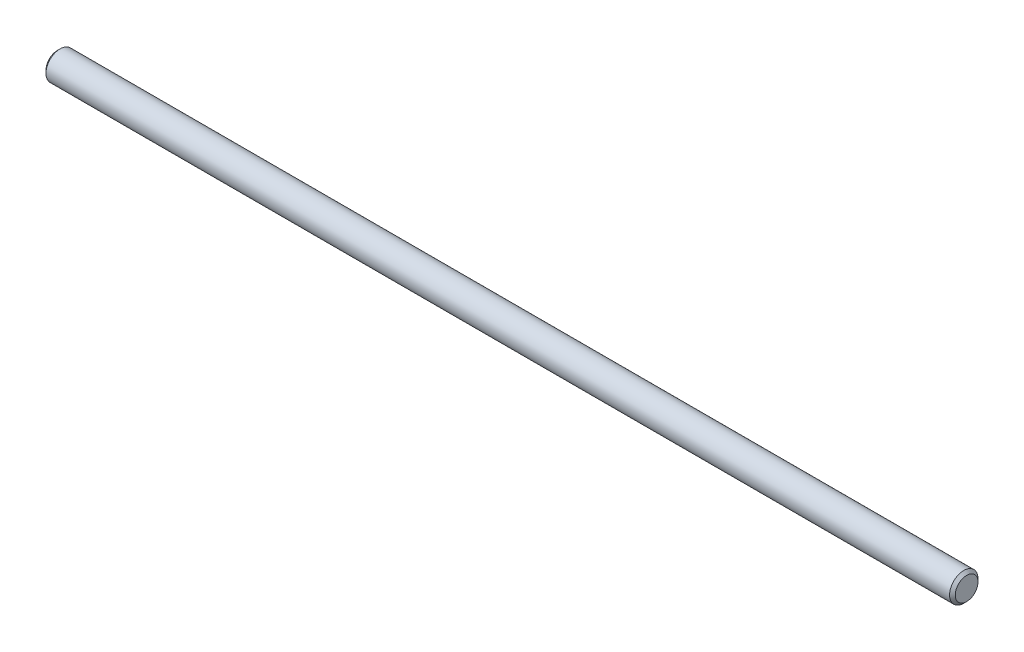
ISO-10303-21;
HEADER;
FILE_DESCRIPTION(('STEP AP214'),'2;1');
FILE_NAME('part.step','',(''),(''),'','','');
FILE_SCHEMA(('AUTOMOTIVE_DESIGN { 1 0 10303 214 1 1 1 1 }'));
ENDSEC;
DATA;
#1=APPLICATION_CONTEXT('core data for automotive mechanical design processes');
#2=APPLICATION_PROTOCOL_DEFINITION('international standard','automotive_design',2000,#1);
#3=PRODUCT_CONTEXT('',#1,'mechanical');
#4=PRODUCT('Part','Part','',(#3));
#5=PRODUCT_RELATED_PRODUCT_CATEGORY('part','',(#4));
#6=PRODUCT_DEFINITION_FORMATION('','',#4);
#7=PRODUCT_DEFINITION_CONTEXT('part definition',#1,'design');
#8=PRODUCT_DEFINITION('design','',#6,#7);
#9=PRODUCT_DEFINITION_SHAPE('','',#8);
#10=(LENGTH_UNIT() NAMED_UNIT(*) SI_UNIT(.MILLI.,.METRE.));
#11=(NAMED_UNIT(*) PLANE_ANGLE_UNIT() SI_UNIT($,.RADIAN.));
#12=(NAMED_UNIT(*) SI_UNIT($,.STERADIAN.) SOLID_ANGLE_UNIT());
#13=UNCERTAINTY_MEASURE_WITH_UNIT(LENGTH_MEASURE(1.E-05),#10,'distance_accuracy_value','');
#14=(GEOMETRIC_REPRESENTATION_CONTEXT(3) GLOBAL_UNCERTAINTY_ASSIGNED_CONTEXT((#13)) GLOBAL_UNIT_ASSIGNED_CONTEXT((#10,
#11,#12)) REPRESENTATION_CONTEXT('',''));
#15=CARTESIAN_POINT('',(0.,0.,0.));
#16=DIRECTION('',(0.,0.,1.));
#17=DIRECTION('',(1.,0.,0.));
#18=AXIS2_PLACEMENT_3D('',#15,#16,#17);
#19=CARTESIAN_POINT('',(-25.4,0.,0.));
#20=DIRECTION('',(1.,0.,0.));
#21=DIRECTION('',(0.,0.,-1.));
#22=AXIS2_PLACEMENT_3D('',#19,#20,#21);
#23=CYLINDRICAL_SURFACE('',#22,0.79375);
#24=CARTESIAN_POINT('',(25.24125,0.,0.));
#25=DIRECTION('',(1.,0.,0.));
#26=DIRECTION('',(0.,0.,-1.));
#27=AXIS2_PLACEMENT_3D('',#24,#25,#26);
#28=CIRCLE('',#27,0.79375);
#29=CARTESIAN_POINT('',(25.24125,0.,-0.79375));
#30=VERTEX_POINT('',#29);
#31=EDGE_CURVE('E37',#30,#30,#28,.F.);
#32=ORIENTED_EDGE('',*,*,#31,.T.);
#33=EDGE_LOOP('',(#32));
#34=FACE_BOUND('',#33,.T.);
#35=CARTESIAN_POINT('',(-25.24125,0.,0.));
#36=DIRECTION('',(1.,0.,0.));
#37=DIRECTION('',(0.,0.,-1.));
#38=AXIS2_PLACEMENT_3D('',#35,#36,#37);
#39=CIRCLE('',#38,0.79375);
#40=CARTESIAN_POINT('',(-25.24125,0.,-0.79375));
#41=VERTEX_POINT('',#40);
#42=EDGE_CURVE('E41',#41,#41,#39,.T.);
#43=ORIENTED_EDGE('',*,*,#42,.T.);
#44=EDGE_LOOP('',(#43));
#45=FACE_BOUND('',#44,.T.);
#46=ADVANCED_FACE('F30',(#34,#45),#23,.T.);
#47=CARTESIAN_POINT('',(-25.4,0.,0.));
#48=DIRECTION('',(1.,0.,0.));
#49=DIRECTION('',(0.,0.,-1.));
#50=AXIS2_PLACEMENT_3D('',#47,#48,#49);
#51=PLANE('',#50);
#52=CARTESIAN_POINT('',(-25.4,0.,0.));
#53=DIRECTION('',(1.,0.,0.));
#54=DIRECTION('',(0.,0.,-1.));
#55=AXIS2_PLACEMENT_3D('',#52,#53,#54);
#56=CIRCLE('',#55,0.635000000000004);
#57=CARTESIAN_POINT('',(-25.4,0.,-0.635000000000004));
#58=VERTEX_POINT('',#57);
#59=EDGE_CURVE('E10',#58,#58,#56,.F.);
#60=ORIENTED_EDGE('',*,*,#59,.T.);
#61=EDGE_LOOP('',(#60));
#62=FACE_BOUND('',#61,.T.);
#63=ADVANCED_FACE('F61',(#62),#51,.F.);
#64=CARTESIAN_POINT('',(25.4,0.,0.));
#65=DIRECTION('',(1.,0.,0.));
#66=DIRECTION('',(0.,0.,-1.));
#67=AXIS2_PLACEMENT_3D('',#64,#65,#66);
#68=PLANE('',#67);
#69=CARTESIAN_POINT('',(25.4,0.,0.));
#70=DIRECTION('',(1.,0.,0.));
#71=DIRECTION('',(0.,0.,-1.));
#72=AXIS2_PLACEMENT_3D('',#69,#70,#71);
#73=CIRCLE('',#72,0.635000000000004);
#74=CARTESIAN_POINT('',(25.4,0.,-0.635000000000004));
#75=VERTEX_POINT('',#74);
#76=EDGE_CURVE('E45',#75,#75,#73,.T.);
#77=ORIENTED_EDGE('',*,*,#76,.T.);
#78=EDGE_LOOP('',(#77));
#79=FACE_BOUND('',#78,.T.);
#80=ADVANCED_FACE('F51',(#79),#68,.T.);
#81=CARTESIAN_POINT('',(25.4,0.,0.));
#82=DIRECTION('',(-1.,0.,0.));
#83=DIRECTION('',(0.,0.,1.));
#84=AXIS2_PLACEMENT_3D('',#81,#82,#83);
#85=CONICAL_SURFACE('',#84,0.635000000000004,0.785398163397461);
#86=ORIENTED_EDGE('',*,*,#31,.F.);
#87=EDGE_LOOP('',(#86));
#88=FACE_BOUND('',#87,.T.);
#89=ORIENTED_EDGE('',*,*,#76,.F.);
#90=EDGE_LOOP('',(#89));
#91=FACE_BOUND('',#90,.T.);
#92=ADVANCED_FACE('F53',(#88,#91),#85,.T.);
#93=CARTESIAN_POINT('',(-25.24125,0.,0.));
#94=DIRECTION('',(1.,0.,0.));
#95=DIRECTION('',(0.,0.,-1.));
#96=AXIS2_PLACEMENT_3D('',#93,#94,#95);
#97=CONICAL_SURFACE('',#96,0.79375,0.785398163397439);
#98=ORIENTED_EDGE('',*,*,#59,.F.);
#99=EDGE_LOOP('',(#98));
#100=FACE_BOUND('',#99,.T.);
#101=ORIENTED_EDGE('',*,*,#42,.F.);
#102=EDGE_LOOP('',(#101));
#103=FACE_BOUND('',#102,.T.);
#104=ADVANCED_FACE('F32',(#100,#103),#97,.T.);
#105=CLOSED_SHELL('',(#46,#63,#80,#92,#104));
#106=MANIFOLD_SOLID_BREP('B2',#105);
#107=ADVANCED_BREP_SHAPE_REPRESENTATION('',(#18,#106),#14);
#108=SHAPE_DEFINITION_REPRESENTATION(#9,#107);
ENDSEC;
END-ISO-10303-21;
